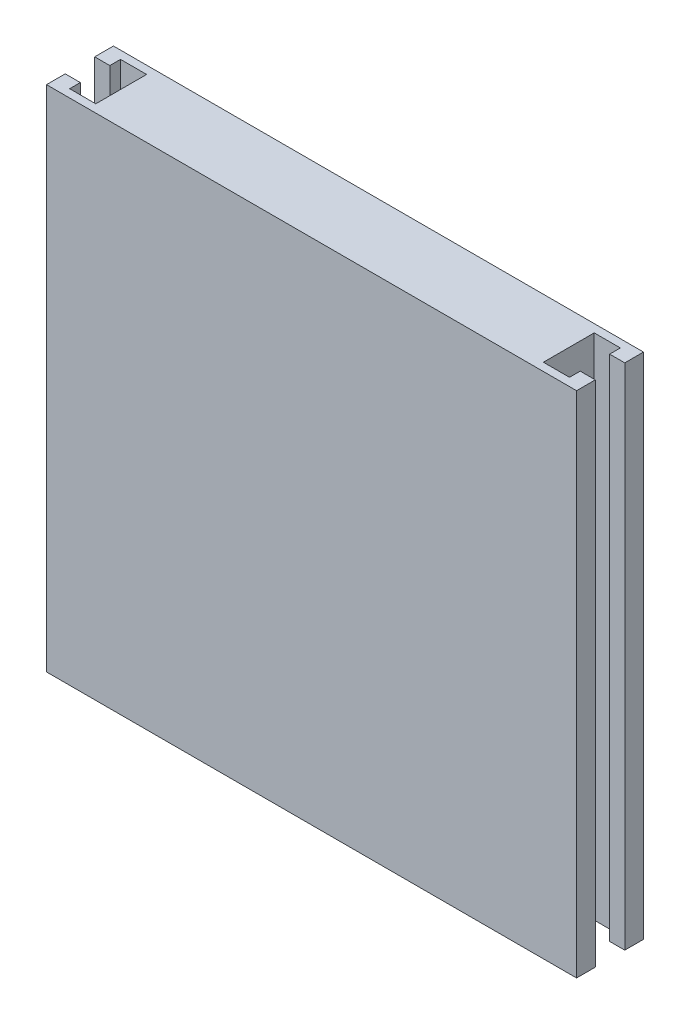
ISO-10303-21;
HEADER;
FILE_DESCRIPTION(('STEP AP214'),'2;1');
FILE_NAME('part.step','',(''),(''),'','','');
FILE_SCHEMA(('AUTOMOTIVE_DESIGN { 1 0 10303 214 1 1 1 1 }'));
ENDSEC;
DATA;
#1=APPLICATION_CONTEXT('core data for automotive mechanical design processes');
#2=APPLICATION_PROTOCOL_DEFINITION('international standard','automotive_design',2000,#1);
#3=PRODUCT_CONTEXT('',#1,'mechanical');
#4=PRODUCT('Part','Part','',(#3));
#5=PRODUCT_RELATED_PRODUCT_CATEGORY('part','',(#4));
#6=PRODUCT_DEFINITION_FORMATION('','',#4);
#7=PRODUCT_DEFINITION_CONTEXT('part definition',#1,'design');
#8=PRODUCT_DEFINITION('design','',#6,#7);
#9=PRODUCT_DEFINITION_SHAPE('','',#8);
#10=(LENGTH_UNIT() NAMED_UNIT(*) SI_UNIT(.MILLI.,.METRE.));
#11=(NAMED_UNIT(*) PLANE_ANGLE_UNIT() SI_UNIT($,.RADIAN.));
#12=(NAMED_UNIT(*) SI_UNIT($,.STERADIAN.) SOLID_ANGLE_UNIT());
#13=UNCERTAINTY_MEASURE_WITH_UNIT(LENGTH_MEASURE(1.E-05),#10,'distance_accuracy_value','');
#14=(GEOMETRIC_REPRESENTATION_CONTEXT(3) GLOBAL_UNCERTAINTY_ASSIGNED_CONTEXT((#13)) GLOBAL_UNIT_ASSIGNED_CONTEXT((#10,
#11,#12)) REPRESENTATION_CONTEXT('',''));
#15=CARTESIAN_POINT('',(0.,0.,0.));
#16=DIRECTION('',(0.,0.,1.));
#17=DIRECTION('',(1.,0.,0.));
#18=AXIS2_PLACEMENT_3D('',#15,#16,#17);
#19=CARTESIAN_POINT('',(0.,190.,-604.865337728875));
#20=DIRECTION('',(0.,0.,1.));
#21=DIRECTION('',(1.,0.,0.));
#22=AXIS2_PLACEMENT_3D('',#19,#20,#21);
#23=PLANE('',#22);
#24=DIRECTION('',(-1.,0.,0.));
#25=VECTOR('',#24,1.);
#26=CARTESIAN_POINT('',(0.,0.,-604.865337728875));
#27=LINE('',#26,#25);
#28=CARTESIAN_POINT('',(331.948189583176,0.,-604.865337728875));
#29=VERTEX_POINT('',#28);
#30=CARTESIAN_POINT('',(322.188097577335,0.,-604.865337728875));
#31=VERTEX_POINT('',#30);
#32=EDGE_CURVE('E142',#29,#31,#27,.T.);
#33=ORIENTED_EDGE('',*,*,#32,.F.);
#34=DIRECTION('',(0.,-1.,0.));
#35=VECTOR('',#34,1.);
#36=CARTESIAN_POINT('',(331.948189583176,190.,-604.865337728875));
#37=LINE('',#36,#35);
#38=CARTESIAN_POINT('',(331.948189583176,190.,-604.865337728875));
#39=VERTEX_POINT('',#38);
#40=EDGE_CURVE('E11',#39,#29,#37,.T.);
#41=ORIENTED_EDGE('',*,*,#40,.F.);
#42=DIRECTION('',(-1.,0.,0.));
#43=VECTOR('',#42,1.);
#44=CARTESIAN_POINT('',(0.,190.,-604.865337728875));
#45=LINE('',#44,#43);
#46=CARTESIAN_POINT('',(322.188097577335,190.,-604.865337728875));
#47=VERTEX_POINT('',#46);
#48=EDGE_CURVE('E172',#39,#47,#45,.T.);
#49=ORIENTED_EDGE('',*,*,#48,.T.);
#50=DIRECTION('',(0.,-1.,0.));
#51=VECTOR('',#50,1.);
#52=CARTESIAN_POINT('',(322.188097577335,190.,-604.865337728875));
#53=LINE('',#52,#51);
#54=EDGE_CURVE('E49',#47,#31,#53,.T.);
#55=ORIENTED_EDGE('',*,*,#54,.T.);
#56=EDGE_LOOP('',(#33,#41,#49,#55));
#57=FACE_BOUND('',#56,.T.);
#58=ADVANCED_FACE('F33',(#57),#23,.T.);
#59=CARTESIAN_POINT('',(331.948189583176,190.,0.));
#60=DIRECTION('',(-1.,0.,0.));
#61=DIRECTION('',(0.,0.,1.));
#62=AXIS2_PLACEMENT_3D('',#59,#60,#61);
#63=PLANE('',#62);
#64=DIRECTION('',(0.,0.,-1.));
#65=VECTOR('',#64,1.);
#66=CARTESIAN_POINT('',(331.948189583176,0.,0.));
#67=LINE('',#66,#65);
#68=CARTESIAN_POINT('',(331.948189583176,0.,-585.865337728875));
#69=VERTEX_POINT('',#68);
#70=EDGE_CURVE('E144',#69,#29,#67,.T.);
#71=ORIENTED_EDGE('',*,*,#70,.F.);
#72=DIRECTION('',(0.,-1.,0.));
#73=VECTOR('',#72,1.);
#74=CARTESIAN_POINT('',(331.948189583176,190.,-585.865337728875));
#75=LINE('',#74,#73);
#76=CARTESIAN_POINT('',(331.948189583176,190.,-585.865337728875));
#77=VERTEX_POINT('',#76);
#78=EDGE_CURVE('E41',#77,#69,#75,.T.);
#79=ORIENTED_EDGE('',*,*,#78,.F.);
#80=DIRECTION('',(0.,0.,-1.));
#81=VECTOR('',#80,1.);
#82=CARTESIAN_POINT('',(331.948189583176,190.,0.));
#83=LINE('',#82,#81);
#84=EDGE_CURVE('E205',#77,#39,#83,.T.);
#85=ORIENTED_EDGE('',*,*,#84,.T.);
#86=ORIENTED_EDGE('',*,*,#40,.T.);
#87=EDGE_LOOP('',(#71,#79,#85,#86));
#88=FACE_BOUND('',#87,.T.);
#89=ADVANCED_FACE('F193',(#88),#63,.T.);
#90=CARTESIAN_POINT('',(0.,190.,-585.865337728875));
#91=DIRECTION('',(0.,0.,-1.));
#92=DIRECTION('',(-1.,0.,0.));
#93=AXIS2_PLACEMENT_3D('',#90,#91,#92);
#94=PLANE('',#93);
#95=DIRECTION('',(1.,0.,0.));
#96=VECTOR('',#95,1.);
#97=CARTESIAN_POINT('',(0.,0.,-585.865337728875));
#98=LINE('',#97,#96);
#99=CARTESIAN_POINT('',(322.188097577335,0.,-585.865337728875));
#100=VERTEX_POINT('',#99);
#101=EDGE_CURVE('E148',#100,#69,#98,.T.);
#102=ORIENTED_EDGE('',*,*,#101,.F.);
#103=DIRECTION('',(0.,-1.,0.));
#104=VECTOR('',#103,1.);
#105=CARTESIAN_POINT('',(322.188097577335,190.,-585.865337728875));
#106=LINE('',#105,#104);
#107=CARTESIAN_POINT('',(322.188097577335,190.,-585.865337728875));
#108=VERTEX_POINT('',#107);
#109=EDGE_CURVE('E182',#108,#100,#106,.T.);
#110=ORIENTED_EDGE('',*,*,#109,.F.);
#111=DIRECTION('',(1.,0.,0.));
#112=VECTOR('',#111,1.);
#113=CARTESIAN_POINT('',(0.,190.,-585.865337728875));
#114=LINE('',#113,#112);
#115=EDGE_CURVE('E189',#108,#77,#114,.T.);
#116=ORIENTED_EDGE('',*,*,#115,.T.);
#117=ORIENTED_EDGE('',*,*,#78,.T.);
#118=EDGE_LOOP('',(#102,#110,#116,#117));
#119=FACE_BOUND('',#118,.T.);
#120=ADVANCED_FACE('F187',(#119),#94,.T.);
#121=CARTESIAN_POINT('',(322.188097577335,190.,0.));
#122=DIRECTION('',(1.,0.,0.));
#123=DIRECTION('',(0.,0.,-1.));
#124=AXIS2_PLACEMENT_3D('',#121,#122,#123);
#125=PLANE('',#124);
#126=DIRECTION('',(0.,0.,1.));
#127=VECTOR('',#126,1.);
#128=CARTESIAN_POINT('',(322.188097577335,0.,0.));
#129=LINE('',#128,#127);
#130=CARTESIAN_POINT('',(322.188097577335,0.,-589.865337728875));
#131=VERTEX_POINT('',#130);
#132=EDGE_CURVE('E151',#131,#100,#129,.T.);
#133=ORIENTED_EDGE('',*,*,#132,.F.);
#134=DIRECTION('',(0.,-1.,0.));
#135=VECTOR('',#134,1.);
#136=CARTESIAN_POINT('',(322.188097577335,190.,-589.865337728875));
#137=LINE('',#136,#135);
#138=CARTESIAN_POINT('',(322.188097577335,190.,-589.865337728875));
#139=VERTEX_POINT('',#138);
#140=EDGE_CURVE('E180',#139,#131,#137,.T.);
#141=ORIENTED_EDGE('',*,*,#140,.F.);
#142=DIRECTION('',(0.,0.,1.));
#143=VECTOR('',#142,1.);
#144=CARTESIAN_POINT('',(322.188097577335,190.,0.));
#145=LINE('',#144,#143);
#146=EDGE_CURVE('E202',#139,#108,#145,.T.);
#147=ORIENTED_EDGE('',*,*,#146,.T.);
#148=ORIENTED_EDGE('',*,*,#109,.T.);
#149=EDGE_LOOP('',(#133,#141,#147,#148));
#150=FACE_BOUND('',#149,.T.);
#151=ADVANCED_FACE('F199',(#150),#125,.T.);
#152=CARTESIAN_POINT('',(0.,190.,-589.865337728875));
#153=DIRECTION('',(0.,0.,-1.));
#154=DIRECTION('',(-1.,0.,0.));
#155=AXIS2_PLACEMENT_3D('',#152,#153,#154);
#156=PLANE('',#155);
#157=DIRECTION('',(1.,0.,0.));
#158=VECTOR('',#157,1.);
#159=CARTESIAN_POINT('',(0.,0.,-589.865337728875));
#160=LINE('',#159,#158);
#161=CARTESIAN_POINT('',(316.547769120811,0.,-589.865337728875));
#162=VERTEX_POINT('',#161);
#163=EDGE_CURVE('E154',#162,#131,#160,.T.);
#164=ORIENTED_EDGE('',*,*,#163,.F.);
#165=DIRECTION('',(0.,-1.,0.));
#166=VECTOR('',#165,1.);
#167=CARTESIAN_POINT('',(316.547769120811,190.,-589.865337728875));
#168=LINE('',#167,#166);
#169=CARTESIAN_POINT('',(316.547769120811,190.,-589.865337728875));
#170=VERTEX_POINT('',#169);
#171=EDGE_CURVE('E178',#170,#162,#168,.T.);
#172=ORIENTED_EDGE('',*,*,#171,.F.);
#173=DIRECTION('',(1.,0.,0.));
#174=VECTOR('',#173,1.);
#175=CARTESIAN_POINT('',(0.,190.,-589.865337728875));
#176=LINE('',#175,#174);
#177=EDGE_CURVE('E207',#170,#139,#176,.T.);
#178=ORIENTED_EDGE('',*,*,#177,.T.);
#179=ORIENTED_EDGE('',*,*,#140,.T.);
#180=EDGE_LOOP('',(#164,#172,#178,#179));
#181=FACE_BOUND('',#180,.T.);
#182=ADVANCED_FACE('F333',(#181),#156,.T.);
#183=CARTESIAN_POINT('',(316.547769120816,190.,-2.51027586908327E-12));
#184=DIRECTION('',(-1.,0.,0.));
#185=DIRECTION('',(0.,0.,1.));
#186=AXIS2_PLACEMENT_3D('',#183,#184,#185);
#187=PLANE('',#186);
#188=DIRECTION('',(0.,0.,-1.));
#189=VECTOR('',#188,1.);
#190=CARTESIAN_POINT('',(316.547769120816,0.,-2.51027586908327E-12));
#191=LINE('',#190,#189);
#192=CARTESIAN_POINT('',(316.547769120811,0.,-582.865337728875));
#193=VERTEX_POINT('',#192);
#194=EDGE_CURVE('E157',#193,#162,#191,.T.);
#195=ORIENTED_EDGE('',*,*,#194,.F.);
#196=DIRECTION('',(0.,-1.,0.));
#197=VECTOR('',#196,1.);
#198=CARTESIAN_POINT('',(316.547769120811,190.,-582.865337728875));
#199=LINE('',#198,#197);
#200=CARTESIAN_POINT('',(316.547769120811,190.,-582.865337728875));
#201=VERTEX_POINT('',#200);
#202=EDGE_CURVE('E176',#201,#193,#199,.T.);
#203=ORIENTED_EDGE('',*,*,#202,.F.);
#204=DIRECTION('',(0.,0.,-1.));
#205=VECTOR('',#204,1.);
#206=CARTESIAN_POINT('',(316.547769120816,190.,-2.51027586908327E-12));
#207=LINE('',#206,#205);
#208=EDGE_CURVE('E213',#201,#170,#207,.T.);
#209=ORIENTED_EDGE('',*,*,#208,.T.);
#210=ORIENTED_EDGE('',*,*,#171,.T.);
#211=EDGE_LOOP('',(#195,#203,#209,#210));
#212=FACE_BOUND('',#211,.T.);
#213=ADVANCED_FACE('F336',(#212),#187,.T.);
#214=CARTESIAN_POINT('',(6.53646988083349E-13,190.,-582.865337728875));
#215=DIRECTION('',(0.,0.,1.));
#216=DIRECTION('',(1.,0.,0.));
#217=AXIS2_PLACEMENT_3D('',#214,#215,#216);
#218=PLANE('',#217);
#219=DIRECTION('',(-1.,0.,0.));
#220=VECTOR('',#219,1.);
#221=CARTESIAN_POINT('',(6.53646988083349E-13,0.,-582.865337728875));
#222=LINE('',#221,#220);
#223=CARTESIAN_POINT('',(514.547769120811,0.,-582.865337728875));
#224=VERTEX_POINT('',#223);
#225=EDGE_CURVE('E160',#224,#193,#222,.T.);
#226=ORIENTED_EDGE('',*,*,#225,.F.);
#227=DIRECTION('',(0.,-1.,0.));
#228=VECTOR('',#227,1.);
#229=CARTESIAN_POINT('',(514.547769120811,190.,-582.865337728875));
#230=LINE('',#229,#228);
#231=CARTESIAN_POINT('',(514.547769120811,190.,-582.865337728875));
#232=VERTEX_POINT('',#231);
#233=EDGE_CURVE('E238',#232,#224,#230,.T.);
#234=ORIENTED_EDGE('',*,*,#233,.F.);
#235=DIRECTION('',(-1.,0.,0.));
#236=VECTOR('',#235,1.);
#237=CARTESIAN_POINT('',(6.53646988083349E-13,190.,-582.865337728875));
#238=LINE('',#237,#236);
#239=EDGE_CURVE('E216',#232,#201,#238,.T.);
#240=ORIENTED_EDGE('',*,*,#239,.T.);
#241=ORIENTED_EDGE('',*,*,#202,.T.);
#242=EDGE_LOOP('',(#226,#234,#240,#241));
#243=FACE_BOUND('',#242,.T.);
#244=ADVANCED_FACE('F340',(#243),#218,.T.);
#245=CARTESIAN_POINT('',(0.,190.,-607.865337728875));
#246=DIRECTION('',(0.,0.,-1.));
#247=DIRECTION('',(-1.,0.,0.));
#248=AXIS2_PLACEMENT_3D('',#245,#246,#247);
#249=PLANE('',#248);
#250=DIRECTION('',(1.,0.,0.));
#251=VECTOR('',#250,1.);
#252=CARTESIAN_POINT('',(0.,0.,-607.865337728875));
#253=LINE('',#252,#251);
#254=CARTESIAN_POINT('',(316.547769120811,0.,-607.865337728875));
#255=VERTEX_POINT('',#254);
#256=CARTESIAN_POINT('',(514.547769120811,0.,-607.865337728875));
#257=VERTEX_POINT('',#256);
#258=EDGE_CURVE('E163',#255,#257,#253,.T.);
#259=ORIENTED_EDGE('',*,*,#258,.F.);
#260=DIRECTION('',(0.,-1.,0.));
#261=VECTOR('',#260,1.);
#262=CARTESIAN_POINT('',(316.547769120811,190.,-607.865337728875));
#263=LINE('',#262,#261);
#264=CARTESIAN_POINT('',(316.547769120811,190.,-607.865337728875));
#265=VERTEX_POINT('',#264);
#266=EDGE_CURVE('E134',#265,#255,#263,.T.);
#267=ORIENTED_EDGE('',*,*,#266,.F.);
#268=DIRECTION('',(1.,0.,0.));
#269=VECTOR('',#268,1.);
#270=CARTESIAN_POINT('',(0.,190.,-607.865337728875));
#271=LINE('',#270,#269);
#272=CARTESIAN_POINT('',(514.547769120811,190.,-607.865337728875));
#273=VERTEX_POINT('',#272);
#274=EDGE_CURVE('E124',#265,#273,#271,.T.);
#275=ORIENTED_EDGE('',*,*,#274,.T.);
#276=DIRECTION('',(0.,-1.,0.));
#277=VECTOR('',#276,1.);
#278=CARTESIAN_POINT('',(514.547769120811,190.,-607.865337728875));
#279=LINE('',#278,#277);
#280=EDGE_CURVE('E225',#273,#257,#279,.T.);
#281=ORIENTED_EDGE('',*,*,#280,.T.);
#282=EDGE_LOOP('',(#259,#267,#275,#281));
#283=FACE_BOUND('',#282,.T.);
#284=ADVANCED_FACE('F223',(#283),#249,.T.);
#285=CARTESIAN_POINT('',(316.547769120811,190.,0.));
#286=DIRECTION('',(1.,0.,0.));
#287=DIRECTION('',(0.,0.,-1.));
#288=AXIS2_PLACEMENT_3D('',#285,#286,#287);
#289=PLANE('',#288);
#290=DIRECTION('',(0.,0.,1.));
#291=VECTOR('',#290,1.);
#292=CARTESIAN_POINT('',(316.547769120811,0.,0.));
#293=LINE('',#292,#291);
#294=CARTESIAN_POINT('',(316.547769120811,0.,-600.865337728875));
#295=VERTEX_POINT('',#294);
#296=EDGE_CURVE('E131',#255,#295,#293,.T.);
#297=ORIENTED_EDGE('',*,*,#296,.T.);
#298=DIRECTION('',(0.,-1.,0.));
#299=VECTOR('',#298,1.);
#300=CARTESIAN_POINT('',(316.547769120811,190.,-600.865337728875));
#301=LINE('',#300,#299);
#302=CARTESIAN_POINT('',(316.547769120811,190.,-600.865337728875));
#303=VERTEX_POINT('',#302);
#304=EDGE_CURVE('E128',#303,#295,#301,.T.);
#305=ORIENTED_EDGE('',*,*,#304,.F.);
#306=DIRECTION('',(0.,0.,1.));
#307=VECTOR('',#306,1.);
#308=CARTESIAN_POINT('',(316.547769120811,190.,0.));
#309=LINE('',#308,#307);
#310=EDGE_CURVE('E116',#265,#303,#309,.T.);
#311=ORIENTED_EDGE('',*,*,#310,.F.);
#312=ORIENTED_EDGE('',*,*,#266,.T.);
#313=EDGE_LOOP('',(#297,#305,#311,#312));
#314=FACE_BOUND('',#313,.T.);
#315=ADVANCED_FACE('F129',(#314),#289,.F.);
#316=CARTESIAN_POINT('',(0.,190.,-600.865337728875));
#317=DIRECTION('',(0.,0.,-1.));
#318=DIRECTION('',(-1.,0.,0.));
#319=AXIS2_PLACEMENT_3D('',#316,#317,#318);
#320=PLANE('',#319);
#321=DIRECTION('',(1.,0.,0.));
#322=VECTOR('',#321,1.);
#323=CARTESIAN_POINT('',(0.,0.,-600.865337728875));
#324=LINE('',#323,#322);
#325=CARTESIAN_POINT('',(322.188097577335,0.,-600.865337728875));
#326=VERTEX_POINT('',#325);
#327=EDGE_CURVE('E167',#295,#326,#324,.T.);
#328=ORIENTED_EDGE('',*,*,#327,.T.);
#329=DIRECTION('',(0.,-1.,0.));
#330=VECTOR('',#329,1.);
#331=CARTESIAN_POINT('',(322.188097577335,190.,-600.865337728875));
#332=LINE('',#331,#330);
#333=CARTESIAN_POINT('',(322.188097577335,190.,-600.865337728875));
#334=VERTEX_POINT('',#333);
#335=EDGE_CURVE('E82',#334,#326,#332,.T.);
#336=ORIENTED_EDGE('',*,*,#335,.F.);
#337=DIRECTION('',(1.,0.,0.));
#338=VECTOR('',#337,1.);
#339=CARTESIAN_POINT('',(0.,190.,-600.865337728875));
#340=LINE('',#339,#338);
#341=EDGE_CURVE('E121',#303,#334,#340,.T.);
#342=ORIENTED_EDGE('',*,*,#341,.F.);
#343=ORIENTED_EDGE('',*,*,#304,.T.);
#344=EDGE_LOOP('',(#328,#336,#342,#343));
#345=FACE_BOUND('',#344,.T.);
#346=ADVANCED_FACE('F136',(#345),#320,.F.);
#347=CARTESIAN_POINT('',(322.188097577335,190.,0.));
#348=DIRECTION('',(1.,0.,0.));
#349=DIRECTION('',(0.,0.,-1.));
#350=AXIS2_PLACEMENT_3D('',#347,#348,#349);
#351=PLANE('',#350);
#352=DIRECTION('',(0.,0.,1.));
#353=VECTOR('',#352,1.);
#354=CARTESIAN_POINT('',(322.188097577335,0.,0.));
#355=LINE('',#354,#353);
#356=EDGE_CURVE('E169',#31,#326,#355,.T.);
#357=ORIENTED_EDGE('',*,*,#356,.F.);
#358=ORIENTED_EDGE('',*,*,#54,.F.);
#359=DIRECTION('',(0.,0.,1.));
#360=VECTOR('',#359,1.);
#361=CARTESIAN_POINT('',(322.188097577335,190.,0.));
#362=LINE('',#361,#360);
#363=EDGE_CURVE('E137',#47,#334,#362,.T.);
#364=ORIENTED_EDGE('',*,*,#363,.T.);
#365=ORIENTED_EDGE('',*,*,#335,.T.);
#366=EDGE_LOOP('',(#357,#358,#364,#365));
#367=FACE_BOUND('',#366,.T.);
#368=ADVANCED_FACE('F312',(#367),#351,.T.);
#369=CARTESIAN_POINT('',(0.,190.,0.));
#370=DIRECTION('',(0.,1.,0.));
#371=DIRECTION('',(0.,0.,1.));
#372=AXIS2_PLACEMENT_3D('',#369,#370,#371);
#373=PLANE('',#372);
#374=ORIENTED_EDGE('',*,*,#48,.F.);
#375=ORIENTED_EDGE('',*,*,#84,.F.);
#376=ORIENTED_EDGE('',*,*,#115,.F.);
#377=ORIENTED_EDGE('',*,*,#146,.F.);
#378=ORIENTED_EDGE('',*,*,#177,.F.);
#379=ORIENTED_EDGE('',*,*,#208,.F.);
#380=ORIENTED_EDGE('',*,*,#239,.F.);
#381=DIRECTION('',(0.,0.,-1.));
#382=VECTOR('',#381,1.);
#383=CARTESIAN_POINT('',(514.547769120806,190.,-2.51027586908327E-12));
#384=LINE('',#383,#382);
#385=CARTESIAN_POINT('',(514.547769120811,190.,-589.865337728875));
#386=VERTEX_POINT('',#385);
#387=EDGE_CURVE('E244',#232,#386,#384,.T.);
#388=ORIENTED_EDGE('',*,*,#387,.T.);
#389=DIRECTION('',(-1.,0.,0.));
#390=VECTOR('',#389,1.);
#391=CARTESIAN_POINT('',(831.095538241622,190.,-589.865337728875));
#392=LINE('',#391,#390);
#393=CARTESIAN_POINT('',(508.907440664287,190.,-589.865337728875));
#394=VERTEX_POINT('',#393);
#395=EDGE_CURVE('E247',#386,#394,#392,.T.);
#396=ORIENTED_EDGE('',*,*,#395,.T.);
#397=DIRECTION('',(0.,0.,1.));
#398=VECTOR('',#397,1.);
#399=CARTESIAN_POINT('',(508.907440664287,190.,0.));
#400=LINE('',#399,#398);
#401=CARTESIAN_POINT('',(508.907440664287,190.,-585.865337728875));
#402=VERTEX_POINT('',#401);
#403=EDGE_CURVE('E255',#394,#402,#400,.T.);
#404=ORIENTED_EDGE('',*,*,#403,.T.);
#405=DIRECTION('',(-1.,0.,0.));
#406=VECTOR('',#405,1.);
#407=CARTESIAN_POINT('',(831.095538241622,190.,-585.865337728875));
#408=LINE('',#407,#406);
#409=CARTESIAN_POINT('',(499.147348658446,190.,-585.865337728875));
#410=VERTEX_POINT('',#409);
#411=EDGE_CURVE('E258',#402,#410,#408,.T.);
#412=ORIENTED_EDGE('',*,*,#411,.T.);
#413=DIRECTION('',(0.,0.,-1.));
#414=VECTOR('',#413,1.);
#415=CARTESIAN_POINT('',(499.147348658446,190.,0.));
#416=LINE('',#415,#414);
#417=CARTESIAN_POINT('',(499.147348658446,190.,-604.865337728875));
#418=VERTEX_POINT('',#417);
#419=EDGE_CURVE('E261',#410,#418,#416,.T.);
#420=ORIENTED_EDGE('',*,*,#419,.T.);
#421=DIRECTION('',(1.,0.,0.));
#422=VECTOR('',#421,1.);
#423=CARTESIAN_POINT('',(831.095538241622,190.,-604.865337728875));
#424=LINE('',#423,#422);
#425=CARTESIAN_POINT('',(508.907440664287,190.,-604.865337728875));
#426=VERTEX_POINT('',#425);
#427=EDGE_CURVE('E290',#418,#426,#424,.T.);
#428=ORIENTED_EDGE('',*,*,#427,.T.);
#429=DIRECTION('',(0.,0.,1.));
#430=VECTOR('',#429,1.);
#431=CARTESIAN_POINT('',(508.907440664287,190.,0.));
#432=LINE('',#431,#430);
#433=CARTESIAN_POINT('',(508.907440664287,190.,-600.865337728875));
#434=VERTEX_POINT('',#433);
#435=EDGE_CURVE('E249',#426,#434,#432,.T.);
#436=ORIENTED_EDGE('',*,*,#435,.T.);
#437=DIRECTION('',(-1.,0.,0.));
#438=VECTOR('',#437,1.);
#439=CARTESIAN_POINT('',(831.095538241622,190.,-600.865337728875));
#440=LINE('',#439,#438);
#441=CARTESIAN_POINT('',(514.547769120811,190.,-600.865337728875));
#442=VERTEX_POINT('',#441);
#443=EDGE_CURVE('E243',#442,#434,#440,.T.);
#444=ORIENTED_EDGE('',*,*,#443,.F.);
#445=DIRECTION('',(0.,0.,1.));
#446=VECTOR('',#445,1.);
#447=CARTESIAN_POINT('',(514.547769120811,190.,0.));
#448=LINE('',#447,#446);
#449=EDGE_CURVE('E234',#273,#442,#448,.T.);
#450=ORIENTED_EDGE('',*,*,#449,.F.);
#451=ORIENTED_EDGE('',*,*,#274,.F.);
#452=ORIENTED_EDGE('',*,*,#310,.T.);
#453=ORIENTED_EDGE('',*,*,#341,.T.);
#454=ORIENTED_EDGE('',*,*,#363,.F.);
#455=EDGE_LOOP('',(#374,#375,#376,#377,#378,#379,#380,#388,#396,#404,#412,#420,#428,#436,#444,
#450,#451,#452,#453,#454));
#456=FACE_BOUND('',#455,.T.);
#457=ADVANCED_FACE('F118',(#456),#373,.T.);
#458=CARTESIAN_POINT('',(0.,0.,0.));
#459=DIRECTION('',(0.,1.,0.));
#460=DIRECTION('',(0.,0.,1.));
#461=AXIS2_PLACEMENT_3D('',#458,#459,#460);
#462=PLANE('',#461);
#463=ORIENTED_EDGE('',*,*,#32,.T.);
#464=ORIENTED_EDGE('',*,*,#356,.T.);
#465=ORIENTED_EDGE('',*,*,#327,.F.);
#466=ORIENTED_EDGE('',*,*,#296,.F.);
#467=ORIENTED_EDGE('',*,*,#258,.T.);
#468=DIRECTION('',(0.,0.,1.));
#469=VECTOR('',#468,1.);
#470=CARTESIAN_POINT('',(514.547769120811,0.,0.));
#471=LINE('',#470,#469);
#472=CARTESIAN_POINT('',(514.547769120811,0.,-600.865337728875));
#473=VERTEX_POINT('',#472);
#474=EDGE_CURVE('E236',#257,#473,#471,.T.);
#475=ORIENTED_EDGE('',*,*,#474,.T.);
#476=DIRECTION('',(-1.,0.,0.));
#477=VECTOR('',#476,1.);
#478=CARTESIAN_POINT('',(831.095538241622,0.,-600.865337728875));
#479=LINE('',#478,#477);
#480=CARTESIAN_POINT('',(508.907440664287,0.,-600.865337728875));
#481=VERTEX_POINT('',#480);
#482=EDGE_CURVE('E271',#473,#481,#479,.T.);
#483=ORIENTED_EDGE('',*,*,#482,.T.);
#484=DIRECTION('',(0.,0.,1.));
#485=VECTOR('',#484,1.);
#486=CARTESIAN_POINT('',(508.907440664287,0.,0.));
#487=LINE('',#486,#485);
#488=CARTESIAN_POINT('',(508.907440664287,0.,-604.865337728875));
#489=VERTEX_POINT('',#488);
#490=EDGE_CURVE('E268',#489,#481,#487,.T.);
#491=ORIENTED_EDGE('',*,*,#490,.F.);
#492=DIRECTION('',(1.,0.,0.));
#493=VECTOR('',#492,1.);
#494=CARTESIAN_POINT('',(831.095538241622,0.,-604.865337728875));
#495=LINE('',#494,#493);
#496=CARTESIAN_POINT('',(499.147348658446,0.,-604.865337728875));
#497=VERTEX_POINT('',#496);
#498=EDGE_CURVE('E265',#497,#489,#495,.T.);
#499=ORIENTED_EDGE('',*,*,#498,.F.);
#500=DIRECTION('',(0.,0.,-1.));
#501=VECTOR('',#500,1.);
#502=CARTESIAN_POINT('',(499.147348658446,0.,0.));
#503=LINE('',#502,#501);
#504=CARTESIAN_POINT('',(499.147348658446,0.,-585.865337728875));
#505=VERTEX_POINT('',#504);
#506=EDGE_CURVE('E287',#505,#497,#503,.T.);
#507=ORIENTED_EDGE('',*,*,#506,.F.);
#508=DIRECTION('',(-1.,0.,0.));
#509=VECTOR('',#508,1.);
#510=CARTESIAN_POINT('',(831.095538241622,0.,-585.865337728875));
#511=LINE('',#510,#509);
#512=CARTESIAN_POINT('',(508.907440664287,0.,-585.865337728875));
#513=VERTEX_POINT('',#512);
#514=EDGE_CURVE('E284',#513,#505,#511,.T.);
#515=ORIENTED_EDGE('',*,*,#514,.F.);
#516=DIRECTION('',(0.,0.,1.));
#517=VECTOR('',#516,1.);
#518=CARTESIAN_POINT('',(508.907440664287,0.,0.));
#519=LINE('',#518,#517);
#520=CARTESIAN_POINT('',(508.907440664287,0.,-589.865337728875));
#521=VERTEX_POINT('',#520);
#522=EDGE_CURVE('E281',#521,#513,#519,.T.);
#523=ORIENTED_EDGE('',*,*,#522,.F.);
#524=DIRECTION('',(-1.,0.,0.));
#525=VECTOR('',#524,1.);
#526=CARTESIAN_POINT('',(831.095538241622,0.,-589.865337728875));
#527=LINE('',#526,#525);
#528=CARTESIAN_POINT('',(514.547769120811,0.,-589.865337728875));
#529=VERTEX_POINT('',#528);
#530=EDGE_CURVE('E278',#529,#521,#527,.T.);
#531=ORIENTED_EDGE('',*,*,#530,.F.);
#532=DIRECTION('',(0.,0.,-1.));
#533=VECTOR('',#532,1.);
#534=CARTESIAN_POINT('',(514.547769120806,0.,-2.51027586908327E-12));
#535=LINE('',#534,#533);
#536=EDGE_CURVE('E275',#224,#529,#535,.T.);
#537=ORIENTED_EDGE('',*,*,#536,.F.);
#538=ORIENTED_EDGE('',*,*,#225,.T.);
#539=ORIENTED_EDGE('',*,*,#194,.T.);
#540=ORIENTED_EDGE('',*,*,#163,.T.);
#541=ORIENTED_EDGE('',*,*,#132,.T.);
#542=ORIENTED_EDGE('',*,*,#101,.T.);
#543=ORIENTED_EDGE('',*,*,#70,.T.);
#544=EDGE_LOOP('',(#463,#464,#465,#466,#467,#475,#483,#491,#499,#507,#515,#523,#531,#537,#538,
#539,#540,#541,#542,#543));
#545=FACE_BOUND('',#544,.T.);
#546=ADVANCED_FACE('F195',(#545),#462,.F.);
#547=CARTESIAN_POINT('',(831.095538241622,190.,-604.865337728875));
#548=DIRECTION('',(0.,0.,-1.));
#549=DIRECTION('',(-1.,0.,0.));
#550=AXIS2_PLACEMENT_3D('',#547,#548,#549);
#551=PLANE('',#550);
#552=ORIENTED_EDGE('',*,*,#498,.T.);
#553=DIRECTION('',(0.,-1.,0.));
#554=VECTOR('',#553,1.);
#555=CARTESIAN_POINT('',(508.907440664287,190.,-604.865337728875));
#556=LINE('',#555,#554);
#557=EDGE_CURVE('E145',#426,#489,#556,.T.);
#558=ORIENTED_EDGE('',*,*,#557,.F.);
#559=ORIENTED_EDGE('',*,*,#427,.F.);
#560=DIRECTION('',(0.,-1.,0.));
#561=VECTOR('',#560,1.);
#562=CARTESIAN_POINT('',(499.147348658446,190.,-604.865337728875));
#563=LINE('',#562,#561);
#564=EDGE_CURVE('E264',#418,#497,#563,.T.);
#565=ORIENTED_EDGE('',*,*,#564,.T.);
#566=EDGE_LOOP('',(#552,#558,#559,#565));
#567=FACE_BOUND('',#566,.T.);
#568=ADVANCED_FACE('F391',(#567),#551,.F.);
#569=CARTESIAN_POINT('',(508.907440664287,190.,0.));
#570=DIRECTION('',(1.,0.,0.));
#571=DIRECTION('',(0.,0.,-1.));
#572=AXIS2_PLACEMENT_3D('',#569,#570,#571);
#573=PLANE('',#572);
#574=ORIENTED_EDGE('',*,*,#490,.T.);
#575=DIRECTION('',(0.,-1.,0.));
#576=VECTOR('',#575,1.);
#577=CARTESIAN_POINT('',(508.907440664287,190.,-600.865337728875));
#578=LINE('',#577,#576);
#579=EDGE_CURVE('E308',#434,#481,#578,.T.);
#580=ORIENTED_EDGE('',*,*,#579,.F.);
#581=ORIENTED_EDGE('',*,*,#435,.F.);
#582=ORIENTED_EDGE('',*,*,#557,.T.);
#583=EDGE_LOOP('',(#574,#580,#581,#582));
#584=FACE_BOUND('',#583,.T.);
#585=ADVANCED_FACE('F399',(#584),#573,.F.);
#586=CARTESIAN_POINT('',(831.095538241622,190.,-600.865337728875));
#587=DIRECTION('',(0.,0.,1.));
#588=DIRECTION('',(1.,0.,0.));
#589=AXIS2_PLACEMENT_3D('',#586,#587,#588);
#590=PLANE('',#589);
#591=ORIENTED_EDGE('',*,*,#482,.F.);
#592=DIRECTION('',(0.,-1.,0.));
#593=VECTOR('',#592,1.);
#594=CARTESIAN_POINT('',(514.547769120811,190.,-600.865337728875));
#595=LINE('',#594,#593);
#596=EDGE_CURVE('E237',#442,#473,#595,.T.);
#597=ORIENTED_EDGE('',*,*,#596,.F.);
#598=ORIENTED_EDGE('',*,*,#443,.T.);
#599=ORIENTED_EDGE('',*,*,#579,.T.);
#600=EDGE_LOOP('',(#591,#597,#598,#599));
#601=FACE_BOUND('',#600,.T.);
#602=ADVANCED_FACE('F409',(#601),#590,.T.);
#603=CARTESIAN_POINT('',(514.547769120811,190.,0.));
#604=DIRECTION('',(1.,0.,0.));
#605=DIRECTION('',(0.,0.,-1.));
#606=AXIS2_PLACEMENT_3D('',#603,#604,#605);
#607=PLANE('',#606);
#608=ORIENTED_EDGE('',*,*,#474,.F.);
#609=ORIENTED_EDGE('',*,*,#280,.F.);
#610=ORIENTED_EDGE('',*,*,#449,.T.);
#611=ORIENTED_EDGE('',*,*,#596,.T.);
#612=EDGE_LOOP('',(#608,#609,#610,#611));
#613=FACE_BOUND('',#612,.T.);
#614=ADVANCED_FACE('F232',(#613),#607,.T.);
#615=CARTESIAN_POINT('',(514.547769120806,190.,-2.51027586908327E-12));
#616=DIRECTION('',(-1.,0.,0.));
#617=DIRECTION('',(0.,0.,1.));
#618=AXIS2_PLACEMENT_3D('',#615,#616,#617);
#619=PLANE('',#618);
#620=ORIENTED_EDGE('',*,*,#536,.T.);
#621=DIRECTION('',(0.,-1.,0.));
#622=VECTOR('',#621,1.);
#623=CARTESIAN_POINT('',(514.547769120811,190.,-589.865337728875));
#624=LINE('',#623,#622);
#625=EDGE_CURVE('E302',#386,#529,#624,.T.);
#626=ORIENTED_EDGE('',*,*,#625,.F.);
#627=ORIENTED_EDGE('',*,*,#387,.F.);
#628=ORIENTED_EDGE('',*,*,#233,.T.);
#629=EDGE_LOOP('',(#620,#626,#627,#628));
#630=FACE_BOUND('',#629,.T.);
#631=ADVANCED_FACE('F428',(#630),#619,.F.);
#632=CARTESIAN_POINT('',(831.095538241622,190.,-589.865337728875));
#633=DIRECTION('',(0.,0.,1.));
#634=DIRECTION('',(1.,0.,0.));
#635=AXIS2_PLACEMENT_3D('',#632,#633,#634);
#636=PLANE('',#635);
#637=ORIENTED_EDGE('',*,*,#530,.T.);
#638=DIRECTION('',(0.,-1.,0.));
#639=VECTOR('',#638,1.);
#640=CARTESIAN_POINT('',(508.907440664287,190.,-589.865337728875));
#641=LINE('',#640,#639);
#642=EDGE_CURVE('E299',#394,#521,#641,.T.);
#643=ORIENTED_EDGE('',*,*,#642,.F.);
#644=ORIENTED_EDGE('',*,*,#395,.F.);
#645=ORIENTED_EDGE('',*,*,#625,.T.);
#646=EDGE_LOOP('',(#637,#643,#644,#645));
#647=FACE_BOUND('',#646,.T.);
#648=ADVANCED_FACE('F437',(#647),#636,.F.);
#649=CARTESIAN_POINT('',(508.907440664287,190.,0.));
#650=DIRECTION('',(1.,0.,0.));
#651=DIRECTION('',(0.,0.,-1.));
#652=AXIS2_PLACEMENT_3D('',#649,#650,#651);
#653=PLANE('',#652);
#654=ORIENTED_EDGE('',*,*,#522,.T.);
#655=DIRECTION('',(0.,-1.,0.));
#656=VECTOR('',#655,1.);
#657=CARTESIAN_POINT('',(508.907440664287,190.,-585.865337728875));
#658=LINE('',#657,#656);
#659=EDGE_CURVE('E296',#402,#513,#658,.T.);
#660=ORIENTED_EDGE('',*,*,#659,.F.);
#661=ORIENTED_EDGE('',*,*,#403,.F.);
#662=ORIENTED_EDGE('',*,*,#642,.T.);
#663=EDGE_LOOP('',(#654,#660,#661,#662));
#664=FACE_BOUND('',#663,.T.);
#665=ADVANCED_FACE('F447',(#664),#653,.F.);
#666=CARTESIAN_POINT('',(831.095538241622,190.,-585.865337728875));
#667=DIRECTION('',(0.,0.,1.));
#668=DIRECTION('',(1.,0.,0.));
#669=AXIS2_PLACEMENT_3D('',#666,#667,#668);
#670=PLANE('',#669);
#671=ORIENTED_EDGE('',*,*,#514,.T.);
#672=DIRECTION('',(0.,-1.,0.));
#673=VECTOR('',#672,1.);
#674=CARTESIAN_POINT('',(499.147348658446,190.,-585.865337728875));
#675=LINE('',#674,#673);
#676=EDGE_CURVE('E293',#410,#505,#675,.T.);
#677=ORIENTED_EDGE('',*,*,#676,.F.);
#678=ORIENTED_EDGE('',*,*,#411,.F.);
#679=ORIENTED_EDGE('',*,*,#659,.T.);
#680=EDGE_LOOP('',(#671,#677,#678,#679));
#681=FACE_BOUND('',#680,.T.);
#682=ADVANCED_FACE('F457',(#681),#670,.F.);
#683=CARTESIAN_POINT('',(499.147348658446,190.,0.));
#684=DIRECTION('',(-1.,0.,0.));
#685=DIRECTION('',(0.,0.,1.));
#686=AXIS2_PLACEMENT_3D('',#683,#684,#685);
#687=PLANE('',#686);
#688=ORIENTED_EDGE('',*,*,#506,.T.);
#689=ORIENTED_EDGE('',*,*,#564,.F.);
#690=ORIENTED_EDGE('',*,*,#419,.F.);
#691=ORIENTED_EDGE('',*,*,#676,.T.);
#692=EDGE_LOOP('',(#688,#689,#690,#691));
#693=FACE_BOUND('',#692,.T.);
#694=ADVANCED_FACE('F467',(#693),#687,.F.);
#695=CLOSED_SHELL('',(#58,#89,#120,#151,#182,#213,#244,#284,#315,#346,#368,#457,#546,#568,#585,
#602,#614,#631,#648,#665,#682,#694));
#696=MANIFOLD_SOLID_BREP('B2',#695);
#697=ADVANCED_BREP_SHAPE_REPRESENTATION('',(#18,#696),#14);
#698=SHAPE_DEFINITION_REPRESENTATION(#9,#697);
ENDSEC;
END-ISO-10303-21;
